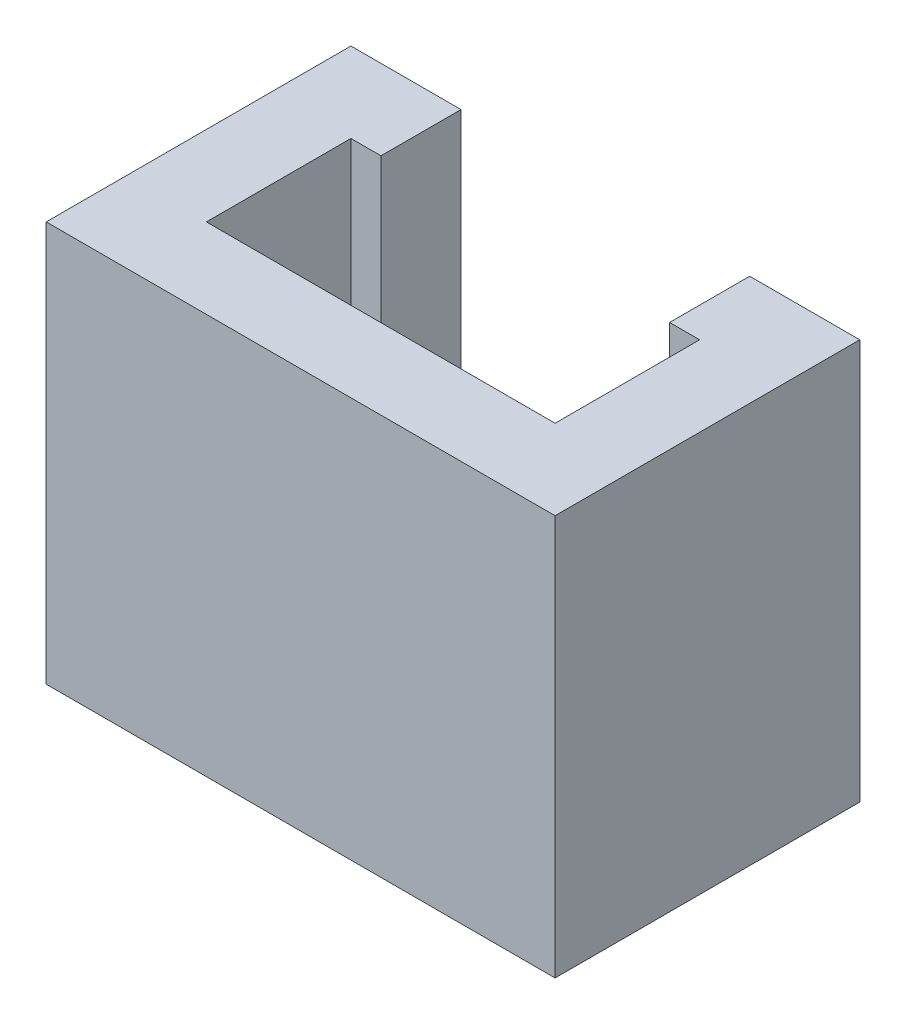
ISO-10303-21;
HEADER;
FILE_DESCRIPTION(('STEP AP214'),'2;1');
FILE_NAME('part.step','',(''),(''),'','','');
FILE_SCHEMA(('AUTOMOTIVE_DESIGN { 1 0 10303 214 1 1 1 1 }'));
ENDSEC;
DATA;
#1=APPLICATION_CONTEXT('core data for automotive mechanical design processes');
#2=APPLICATION_PROTOCOL_DEFINITION('international standard','automotive_design',2000,#1);
#3=PRODUCT_CONTEXT('',#1,'mechanical');
#4=PRODUCT('Part','Part','',(#3));
#5=PRODUCT_RELATED_PRODUCT_CATEGORY('part','',(#4));
#6=PRODUCT_DEFINITION_FORMATION('','',#4);
#7=PRODUCT_DEFINITION_CONTEXT('part definition',#1,'design');
#8=PRODUCT_DEFINITION('design','',#6,#7);
#9=PRODUCT_DEFINITION_SHAPE('','',#8);
#10=(LENGTH_UNIT() NAMED_UNIT(*) SI_UNIT(.MILLI.,.METRE.));
#11=(NAMED_UNIT(*) PLANE_ANGLE_UNIT() SI_UNIT($,.RADIAN.));
#12=(NAMED_UNIT(*) SI_UNIT($,.STERADIAN.) SOLID_ANGLE_UNIT());
#13=UNCERTAINTY_MEASURE_WITH_UNIT(LENGTH_MEASURE(1.E-05),#10,'distance_accuracy_value','');
#14=(GEOMETRIC_REPRESENTATION_CONTEXT(3) GLOBAL_UNCERTAINTY_ASSIGNED_CONTEXT((#13)) GLOBAL_UNIT_ASSIGNED_CONTEXT((#10,
#11,#12)) REPRESENTATION_CONTEXT('',''));
#15=CARTESIAN_POINT('',(0.,0.,0.));
#16=DIRECTION('',(0.,0.,1.));
#17=DIRECTION('',(1.,0.,0.));
#18=AXIS2_PLACEMENT_3D('',#15,#16,#17);
#19=CARTESIAN_POINT('',(8.71,20.,0.));
#20=DIRECTION('',(1.,0.,0.));
#21=DIRECTION('',(0.,0.,-1.));
#22=AXIS2_PLACEMENT_3D('',#19,#20,#21);
#23=PLANE('',#22);
#24=DIRECTION('',(0.,0.,1.));
#25=VECTOR('',#24,1.);
#26=CARTESIAN_POINT('',(8.71,0.,0.));
#27=LINE('',#26,#25);
#28=CARTESIAN_POINT('',(8.71,0.,-7.22));
#29=VERTEX_POINT('',#28);
#30=CARTESIAN_POINT('',(8.71,0.,0.));
#31=VERTEX_POINT('',#30);
#32=EDGE_CURVE('E162',#29,#31,#27,.T.);
#33=ORIENTED_EDGE('',*,*,#32,.T.);
#34=DIRECTION('',(0.,-1.,0.));
#35=VECTOR('',#34,1.);
#36=CARTESIAN_POINT('',(8.71,20.,0.));
#37=LINE('',#36,#35);
#38=CARTESIAN_POINT('',(8.71,20.,0.));
#39=VERTEX_POINT('',#38);
#40=EDGE_CURVE('E11',#39,#31,#37,.T.);
#41=ORIENTED_EDGE('',*,*,#40,.F.);
#42=DIRECTION('',(0.,0.,1.));
#43=VECTOR('',#42,1.);
#44=CARTESIAN_POINT('',(8.71,20.,0.));
#45=LINE('',#44,#43);
#46=CARTESIAN_POINT('',(8.71,20.,-7.22));
#47=VERTEX_POINT('',#46);
#48=EDGE_CURVE('E184',#47,#39,#45,.T.);
#49=ORIENTED_EDGE('',*,*,#48,.F.);
#50=DIRECTION('',(0.,-1.,0.));
#51=VECTOR('',#50,1.);
#52=CARTESIAN_POINT('',(8.71,20.,-7.22));
#53=LINE('',#52,#51);
#54=EDGE_CURVE('E158',#47,#29,#53,.T.);
#55=ORIENTED_EDGE('',*,*,#54,.T.);
#56=EDGE_LOOP('',(#33,#41,#49,#55));
#57=FACE_BOUND('',#56,.T.);
#58=ADVANCED_FACE('F42',(#57),#23,.F.);
#59=CARTESIAN_POINT('',(-8.71,20.,0.));
#60=DIRECTION('',(0.,0.,1.));
#61=DIRECTION('',(1.,0.,0.));
#62=AXIS2_PLACEMENT_3D('',#59,#60,#61);
#63=PLANE('',#62);
#64=DIRECTION('',(-1.,0.,0.));
#65=VECTOR('',#64,1.);
#66=CARTESIAN_POINT('',(-8.71,0.,0.));
#67=LINE('',#66,#65);
#68=CARTESIAN_POINT('',(-8.71,0.,0.));
#69=VERTEX_POINT('',#68);
#70=EDGE_CURVE('E165',#31,#69,#67,.T.);
#71=ORIENTED_EDGE('',*,*,#70,.T.);
#72=DIRECTION('',(0.,-1.,0.));
#73=VECTOR('',#72,1.);
#74=CARTESIAN_POINT('',(-8.71,20.,0.));
#75=LINE('',#74,#73);
#76=CARTESIAN_POINT('',(-8.71,20.,0.));
#77=VERTEX_POINT('',#76);
#78=EDGE_CURVE('E50',#77,#69,#75,.T.);
#79=ORIENTED_EDGE('',*,*,#78,.F.);
#80=DIRECTION('',(-1.,0.,0.));
#81=VECTOR('',#80,1.);
#82=CARTESIAN_POINT('',(-8.71,20.,0.));
#83=LINE('',#82,#81);
#84=EDGE_CURVE('E113',#39,#77,#83,.T.);
#85=ORIENTED_EDGE('',*,*,#84,.F.);
#86=ORIENTED_EDGE('',*,*,#40,.T.);
#87=EDGE_LOOP('',(#71,#79,#85,#86));
#88=FACE_BOUND('',#87,.T.);
#89=ADVANCED_FACE('F262',(#88),#63,.F.);
#90=CARTESIAN_POINT('',(-8.71,20.,0.));
#91=DIRECTION('',(-1.,0.,0.));
#92=DIRECTION('',(0.,0.,1.));
#93=AXIS2_PLACEMENT_3D('',#90,#91,#92);
#94=PLANE('',#93);
#95=DIRECTION('',(0.,0.,-1.));
#96=VECTOR('',#95,1.);
#97=CARTESIAN_POINT('',(-8.71,0.,0.));
#98=LINE('',#97,#96);
#99=CARTESIAN_POINT('',(-8.71,0.,-7.22));
#100=VERTEX_POINT('',#99);
#101=EDGE_CURVE('E167',#69,#100,#98,.T.);
#102=ORIENTED_EDGE('',*,*,#101,.T.);
#103=DIRECTION('',(0.,-1.,0.));
#104=VECTOR('',#103,1.);
#105=CARTESIAN_POINT('',(-8.71,20.,-7.22));
#106=LINE('',#105,#104);
#107=CARTESIAN_POINT('',(-8.71,20.,-7.22));
#108=VERTEX_POINT('',#107);
#109=EDGE_CURVE('E203',#108,#100,#106,.T.);
#110=ORIENTED_EDGE('',*,*,#109,.F.);
#111=DIRECTION('',(0.,0.,-1.));
#112=VECTOR('',#111,1.);
#113=CARTESIAN_POINT('',(-8.71,20.,0.));
#114=LINE('',#113,#112);
#115=EDGE_CURVE('E211',#77,#108,#114,.T.);
#116=ORIENTED_EDGE('',*,*,#115,.F.);
#117=ORIENTED_EDGE('',*,*,#78,.T.);
#118=EDGE_LOOP('',(#102,#110,#116,#117));
#119=FACE_BOUND('',#118,.T.);
#120=ADVANCED_FACE('F209',(#119),#94,.F.);
#121=CARTESIAN_POINT('',(-8.71,20.,-7.22));
#122=DIRECTION('',(0.,0.,-1.));
#123=DIRECTION('',(-1.,0.,0.));
#124=AXIS2_PLACEMENT_3D('',#121,#122,#123);
#125=PLANE('',#124);
#126=DIRECTION('',(1.,0.,0.));
#127=VECTOR('',#126,1.);
#128=CARTESIAN_POINT('',(-8.71,0.,-7.22));
#129=LINE('',#128,#127);
#130=CARTESIAN_POINT('',(-7.21,0.,-7.22));
#131=VERTEX_POINT('',#130);
#132=EDGE_CURVE('E169',#100,#131,#129,.T.);
#133=ORIENTED_EDGE('',*,*,#132,.T.);
#134=DIRECTION('',(0.,-1.,0.));
#135=VECTOR('',#134,1.);
#136=CARTESIAN_POINT('',(-7.21,20.,-7.22));
#137=LINE('',#136,#135);
#138=CARTESIAN_POINT('',(-7.21,20.,-7.22));
#139=VERTEX_POINT('',#138);
#140=EDGE_CURVE('E200',#139,#131,#137,.T.);
#141=ORIENTED_EDGE('',*,*,#140,.F.);
#142=DIRECTION('',(1.,0.,0.));
#143=VECTOR('',#142,1.);
#144=CARTESIAN_POINT('',(-8.71,20.,-7.22));
#145=LINE('',#144,#143);
#146=EDGE_CURVE('E229',#108,#139,#145,.T.);
#147=ORIENTED_EDGE('',*,*,#146,.F.);
#148=ORIENTED_EDGE('',*,*,#109,.T.);
#149=EDGE_LOOP('',(#133,#141,#147,#148));
#150=FACE_BOUND('',#149,.T.);
#151=ADVANCED_FACE('F220',(#150),#125,.F.);
#152=CARTESIAN_POINT('',(-7.21,20.,-7.22));
#153=DIRECTION('',(-1.,0.,0.));
#154=DIRECTION('',(0.,0.,1.));
#155=AXIS2_PLACEMENT_3D('',#152,#153,#154);
#156=PLANE('',#155);
#157=DIRECTION('',(0.,0.,-1.));
#158=VECTOR('',#157,1.);
#159=CARTESIAN_POINT('',(-7.21,0.,-7.22));
#160=LINE('',#159,#158);
#161=CARTESIAN_POINT('',(-7.21,0.,-11.22));
#162=VERTEX_POINT('',#161);
#163=EDGE_CURVE('E171',#131,#162,#160,.T.);
#164=ORIENTED_EDGE('',*,*,#163,.T.);
#165=DIRECTION('',(0.,-1.,0.));
#166=VECTOR('',#165,1.);
#167=CARTESIAN_POINT('',(-7.21,20.,-11.22));
#168=LINE('',#167,#166);
#169=CARTESIAN_POINT('',(-7.21,20.,-11.22));
#170=VERTEX_POINT('',#169);
#171=EDGE_CURVE('E197',#170,#162,#168,.T.);
#172=ORIENTED_EDGE('',*,*,#171,.F.);
#173=DIRECTION('',(0.,0.,-1.));
#174=VECTOR('',#173,1.);
#175=CARTESIAN_POINT('',(-7.21,20.,-7.22));
#176=LINE('',#175,#174);
#177=EDGE_CURVE('E226',#139,#170,#176,.T.);
#178=ORIENTED_EDGE('',*,*,#177,.F.);
#179=ORIENTED_EDGE('',*,*,#140,.T.);
#180=EDGE_LOOP('',(#164,#172,#178,#179));
#181=FACE_BOUND('',#180,.T.);
#182=ADVANCED_FACE('F224',(#181),#156,.F.);
#183=CARTESIAN_POINT('',(-12.71,20.,-11.22));
#184=DIRECTION('',(0.,0.,1.));
#185=DIRECTION('',(1.,0.,0.));
#186=AXIS2_PLACEMENT_3D('',#183,#184,#185);
#187=PLANE('',#186);
#188=DIRECTION('',(-1.,0.,0.));
#189=VECTOR('',#188,1.);
#190=CARTESIAN_POINT('',(-12.71,0.,-11.22));
#191=LINE('',#190,#189);
#192=CARTESIAN_POINT('',(-12.71,0.,-11.22));
#193=VERTEX_POINT('',#192);
#194=EDGE_CURVE('E173',#162,#193,#191,.T.);
#195=ORIENTED_EDGE('',*,*,#194,.T.);
#196=DIRECTION('',(0.,-1.,0.));
#197=VECTOR('',#196,1.);
#198=CARTESIAN_POINT('',(-12.71,20.,-11.22));
#199=LINE('',#198,#197);
#200=CARTESIAN_POINT('',(-12.71,20.,-11.22));
#201=VERTEX_POINT('',#200);
#202=EDGE_CURVE('E194',#201,#193,#199,.T.);
#203=ORIENTED_EDGE('',*,*,#202,.F.);
#204=DIRECTION('',(-1.,0.,0.));
#205=VECTOR('',#204,1.);
#206=CARTESIAN_POINT('',(-12.71,20.,-11.22));
#207=LINE('',#206,#205);
#208=EDGE_CURVE('E228',#170,#201,#207,.T.);
#209=ORIENTED_EDGE('',*,*,#208,.F.);
#210=ORIENTED_EDGE('',*,*,#171,.T.);
#211=EDGE_LOOP('',(#195,#203,#209,#210));
#212=FACE_BOUND('',#211,.T.);
#213=ADVANCED_FACE('F275',(#212),#187,.F.);
#214=CARTESIAN_POINT('',(-12.71,20.,4.));
#215=DIRECTION('',(1.,0.,0.));
#216=DIRECTION('',(0.,0.,-1.));
#217=AXIS2_PLACEMENT_3D('',#214,#215,#216);
#218=PLANE('',#217);
#219=DIRECTION('',(0.,0.,1.));
#220=VECTOR('',#219,1.);
#221=CARTESIAN_POINT('',(-12.71,0.,4.));
#222=LINE('',#221,#220);
#223=CARTESIAN_POINT('',(-12.71,0.,4.));
#224=VERTEX_POINT('',#223);
#225=EDGE_CURVE('E175',#193,#224,#222,.T.);
#226=ORIENTED_EDGE('',*,*,#225,.T.);
#227=DIRECTION('',(0.,-1.,0.));
#228=VECTOR('',#227,1.);
#229=CARTESIAN_POINT('',(-12.71,20.,4.));
#230=LINE('',#229,#228);
#231=CARTESIAN_POINT('',(-12.71,20.,4.));
#232=VERTEX_POINT('',#231);
#233=EDGE_CURVE('E191',#232,#224,#230,.T.);
#234=ORIENTED_EDGE('',*,*,#233,.F.);
#235=DIRECTION('',(0.,0.,1.));
#236=VECTOR('',#235,1.);
#237=CARTESIAN_POINT('',(-12.71,20.,4.));
#238=LINE('',#237,#236);
#239=EDGE_CURVE('E231',#201,#232,#238,.T.);
#240=ORIENTED_EDGE('',*,*,#239,.F.);
#241=ORIENTED_EDGE('',*,*,#202,.T.);
#242=EDGE_LOOP('',(#226,#234,#240,#241));
#243=FACE_BOUND('',#242,.T.);
#244=ADVANCED_FACE('F278',(#243),#218,.F.);
#245=CARTESIAN_POINT('',(-12.71,20.,4.));
#246=DIRECTION('',(0.,0.,-1.));
#247=DIRECTION('',(-1.,0.,0.));
#248=AXIS2_PLACEMENT_3D('',#245,#246,#247);
#249=PLANE('',#248);
#250=DIRECTION('',(1.,0.,0.));
#251=VECTOR('',#250,1.);
#252=CARTESIAN_POINT('',(-12.71,0.,4.));
#253=LINE('',#252,#251);
#254=CARTESIAN_POINT('',(12.71,0.,4.));
#255=VERTEX_POINT('',#254);
#256=EDGE_CURVE('E177',#224,#255,#253,.T.);
#257=ORIENTED_EDGE('',*,*,#256,.T.);
#258=DIRECTION('',(0.,-1.,0.));
#259=VECTOR('',#258,1.);
#260=CARTESIAN_POINT('',(12.71,20.,4.));
#261=LINE('',#260,#259);
#262=CARTESIAN_POINT('',(12.71,20.,4.));
#263=VERTEX_POINT('',#262);
#264=EDGE_CURVE('E188',#263,#255,#261,.T.);
#265=ORIENTED_EDGE('',*,*,#264,.F.);
#266=DIRECTION('',(1.,0.,0.));
#267=VECTOR('',#266,1.);
#268=CARTESIAN_POINT('',(-12.71,20.,4.));
#269=LINE('',#268,#267);
#270=EDGE_CURVE('E237',#232,#263,#269,.T.);
#271=ORIENTED_EDGE('',*,*,#270,.F.);
#272=ORIENTED_EDGE('',*,*,#233,.T.);
#273=EDGE_LOOP('',(#257,#265,#271,#272));
#274=FACE_BOUND('',#273,.T.);
#275=ADVANCED_FACE('F243',(#274),#249,.F.);
#276=CARTESIAN_POINT('',(12.71,20.,4.));
#277=DIRECTION('',(-1.,0.,0.));
#278=DIRECTION('',(0.,0.,1.));
#279=AXIS2_PLACEMENT_3D('',#276,#277,#278);
#280=PLANE('',#279);
#281=DIRECTION('',(0.,0.,-1.));
#282=VECTOR('',#281,1.);
#283=CARTESIAN_POINT('',(12.71,0.,4.));
#284=LINE('',#283,#282);
#285=CARTESIAN_POINT('',(12.71,0.,-11.22));
#286=VERTEX_POINT('',#285);
#287=EDGE_CURVE('E179',#255,#286,#284,.T.);
#288=ORIENTED_EDGE('',*,*,#287,.T.);
#289=DIRECTION('',(0.,-1.,0.));
#290=VECTOR('',#289,1.);
#291=CARTESIAN_POINT('',(12.71,20.,-11.22));
#292=LINE('',#291,#290);
#293=CARTESIAN_POINT('',(12.71,20.,-11.22));
#294=VERTEX_POINT('',#293);
#295=EDGE_CURVE('E153',#294,#286,#292,.T.);
#296=ORIENTED_EDGE('',*,*,#295,.F.);
#297=DIRECTION('',(0.,0.,-1.));
#298=VECTOR('',#297,1.);
#299=CARTESIAN_POINT('',(12.71,20.,4.));
#300=LINE('',#299,#298);
#301=EDGE_CURVE('E144',#263,#294,#300,.T.);
#302=ORIENTED_EDGE('',*,*,#301,.F.);
#303=ORIENTED_EDGE('',*,*,#264,.T.);
#304=EDGE_LOOP('',(#288,#296,#302,#303));
#305=FACE_BOUND('',#304,.T.);
#306=ADVANCED_FACE('F247',(#305),#280,.F.);
#307=CARTESIAN_POINT('',(12.71,20.,-11.22));
#308=DIRECTION('',(0.,0.,1.));
#309=DIRECTION('',(1.,0.,0.));
#310=AXIS2_PLACEMENT_3D('',#307,#308,#309);
#311=PLANE('',#310);
#312=DIRECTION('',(-1.,0.,0.));
#313=VECTOR('',#312,1.);
#314=CARTESIAN_POINT('',(12.71,0.,-11.22));
#315=LINE('',#314,#313);
#316=CARTESIAN_POINT('',(7.21,0.,-11.22));
#317=VERTEX_POINT('',#316);
#318=EDGE_CURVE('E152',#286,#317,#315,.T.);
#319=ORIENTED_EDGE('',*,*,#318,.T.);
#320=DIRECTION('',(0.,-1.,0.));
#321=VECTOR('',#320,1.);
#322=CARTESIAN_POINT('',(7.21,20.,-11.22));
#323=LINE('',#322,#321);
#324=CARTESIAN_POINT('',(7.21,20.,-11.22));
#325=VERTEX_POINT('',#324);
#326=EDGE_CURVE('E149',#325,#317,#323,.T.);
#327=ORIENTED_EDGE('',*,*,#326,.F.);
#328=DIRECTION('',(-1.,0.,0.));
#329=VECTOR('',#328,1.);
#330=CARTESIAN_POINT('',(12.71,20.,-11.22));
#331=LINE('',#330,#329);
#332=EDGE_CURVE('E138',#294,#325,#331,.T.);
#333=ORIENTED_EDGE('',*,*,#332,.F.);
#334=ORIENTED_EDGE('',*,*,#295,.T.);
#335=EDGE_LOOP('',(#319,#327,#333,#334));
#336=FACE_BOUND('',#335,.T.);
#337=ADVANCED_FACE('F150',(#336),#311,.F.);
#338=CARTESIAN_POINT('',(7.21,20.,-11.22));
#339=DIRECTION('',(1.,0.,0.));
#340=DIRECTION('',(0.,0.,-1.));
#341=AXIS2_PLACEMENT_3D('',#338,#339,#340);
#342=PLANE('',#341);
#343=DIRECTION('',(0.,0.,1.));
#344=VECTOR('',#343,1.);
#345=CARTESIAN_POINT('',(7.21,0.,-11.22));
#346=LINE('',#345,#344);
#347=CARTESIAN_POINT('',(7.21,0.,-7.22));
#348=VERTEX_POINT('',#347);
#349=EDGE_CURVE('E99',#317,#348,#346,.T.);
#350=ORIENTED_EDGE('',*,*,#349,.T.);
#351=DIRECTION('',(0.,-1.,0.));
#352=VECTOR('',#351,1.);
#353=CARTESIAN_POINT('',(7.21,20.,-7.22));
#354=LINE('',#353,#352);
#355=CARTESIAN_POINT('',(7.21,20.,-7.22));
#356=VERTEX_POINT('',#355);
#357=EDGE_CURVE('E154',#356,#348,#354,.T.);
#358=ORIENTED_EDGE('',*,*,#357,.F.);
#359=DIRECTION('',(0.,0.,1.));
#360=VECTOR('',#359,1.);
#361=CARTESIAN_POINT('',(7.21,20.,-11.22));
#362=LINE('',#361,#360);
#363=EDGE_CURVE('E142',#325,#356,#362,.T.);
#364=ORIENTED_EDGE('',*,*,#363,.F.);
#365=ORIENTED_EDGE('',*,*,#326,.T.);
#366=EDGE_LOOP('',(#350,#358,#364,#365));
#367=FACE_BOUND('',#366,.T.);
#368=ADVANCED_FACE('F156',(#367),#342,.F.);
#369=CARTESIAN_POINT('',(8.71,20.,-7.22));
#370=DIRECTION('',(0.,0.,-1.));
#371=DIRECTION('',(-1.,0.,0.));
#372=AXIS2_PLACEMENT_3D('',#369,#370,#371);
#373=PLANE('',#372);
#374=DIRECTION('',(1.,0.,0.));
#375=VECTOR('',#374,1.);
#376=CARTESIAN_POINT('',(8.71,0.,-7.22));
#377=LINE('',#376,#375);
#378=EDGE_CURVE('E105',#348,#29,#377,.T.);
#379=ORIENTED_EDGE('',*,*,#378,.T.);
#380=ORIENTED_EDGE('',*,*,#54,.F.);
#381=DIRECTION('',(1.,0.,0.));
#382=VECTOR('',#381,1.);
#383=CARTESIAN_POINT('',(8.71,20.,-7.22));
#384=LINE('',#383,#382);
#385=EDGE_CURVE('E58',#356,#47,#384,.T.);
#386=ORIENTED_EDGE('',*,*,#385,.F.);
#387=ORIENTED_EDGE('',*,*,#357,.T.);
#388=EDGE_LOOP('',(#379,#380,#386,#387));
#389=FACE_BOUND('',#388,.T.);
#390=ADVANCED_FACE('F251',(#389),#373,.F.);
#391=CARTESIAN_POINT('',(0.,20.,0.));
#392=DIRECTION('',(0.,1.,0.));
#393=DIRECTION('',(0.,0.,1.));
#394=AXIS2_PLACEMENT_3D('',#391,#392,#393);
#395=PLANE('',#394);
#396=ORIENTED_EDGE('',*,*,#48,.T.);
#397=ORIENTED_EDGE('',*,*,#84,.T.);
#398=ORIENTED_EDGE('',*,*,#115,.T.);
#399=ORIENTED_EDGE('',*,*,#146,.T.);
#400=ORIENTED_EDGE('',*,*,#177,.T.);
#401=ORIENTED_EDGE('',*,*,#208,.T.);
#402=ORIENTED_EDGE('',*,*,#239,.T.);
#403=ORIENTED_EDGE('',*,*,#270,.T.);
#404=ORIENTED_EDGE('',*,*,#301,.T.);
#405=ORIENTED_EDGE('',*,*,#332,.T.);
#406=ORIENTED_EDGE('',*,*,#363,.T.);
#407=ORIENTED_EDGE('',*,*,#385,.T.);
#408=EDGE_LOOP('',(#396,#397,#398,#399,#400,#401,#402,#403,#404,#405,#406,#407));
#409=FACE_BOUND('',#408,.T.);
#410=ADVANCED_FACE('F140',(#409),#395,.T.);
#411=CARTESIAN_POINT('',(0.,0.,0.));
#412=DIRECTION('',(0.,1.,0.));
#413=DIRECTION('',(0.,0.,1.));
#414=AXIS2_PLACEMENT_3D('',#411,#412,#413);
#415=PLANE('',#414);
#416=ORIENTED_EDGE('',*,*,#32,.F.);
#417=ORIENTED_EDGE('',*,*,#378,.F.);
#418=ORIENTED_EDGE('',*,*,#349,.F.);
#419=ORIENTED_EDGE('',*,*,#318,.F.);
#420=ORIENTED_EDGE('',*,*,#287,.F.);
#421=ORIENTED_EDGE('',*,*,#256,.F.);
#422=ORIENTED_EDGE('',*,*,#225,.F.);
#423=ORIENTED_EDGE('',*,*,#194,.F.);
#424=ORIENTED_EDGE('',*,*,#163,.F.);
#425=ORIENTED_EDGE('',*,*,#132,.F.);
#426=ORIENTED_EDGE('',*,*,#101,.F.);
#427=ORIENTED_EDGE('',*,*,#70,.F.);
#428=EDGE_LOOP('',(#416,#417,#418,#419,#420,#421,#422,#423,#424,#425,#426,#427));
#429=FACE_BOUND('',#428,.T.);
#430=ADVANCED_FACE('F215',(#429),#415,.F.);
#431=CLOSED_SHELL('',(#58,#89,#120,#151,#182,#213,#244,#275,#306,#337,#368,#390,#410,#430));
#432=MANIFOLD_SOLID_BREP('B2',#431);
#433=ADVANCED_BREP_SHAPE_REPRESENTATION('',(#18,#432),#14);
#434=SHAPE_DEFINITION_REPRESENTATION(#9,#433);
ENDSEC;
END-ISO-10303-21;
